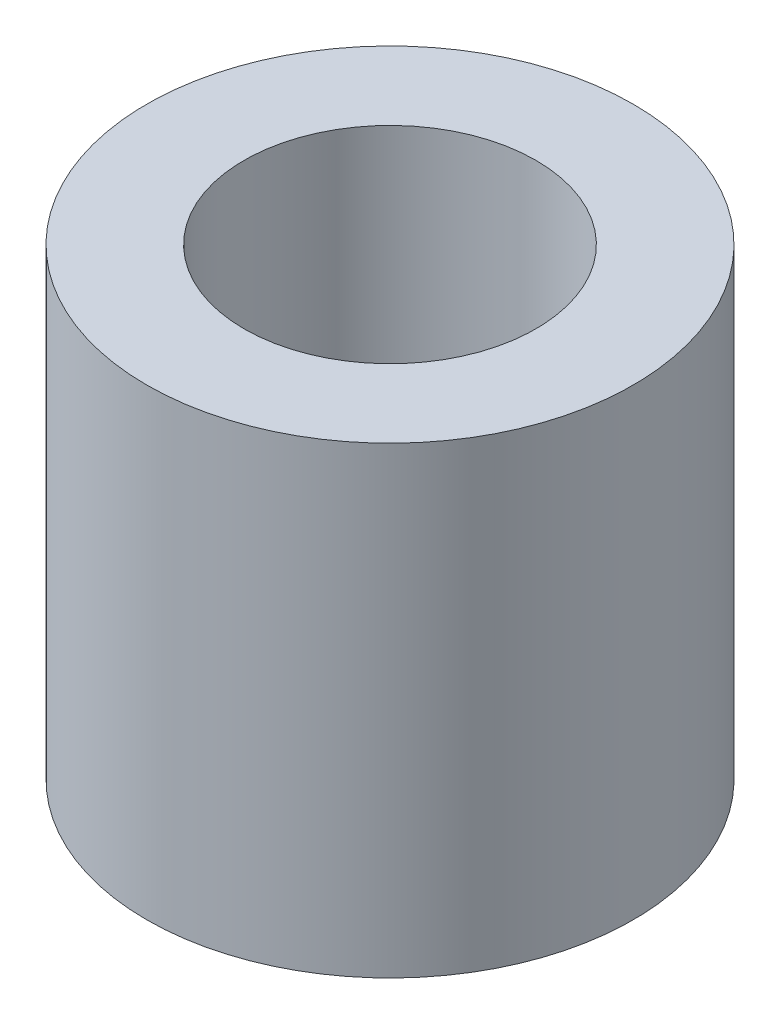
ISO-10303-21;
HEADER;
FILE_DESCRIPTION(('STEP AP214'),'2;1');
FILE_NAME('part.step','',(''),(''),'','','');
FILE_SCHEMA(('AUTOMOTIVE_DESIGN { 1 0 10303 214 1 1 1 1 }'));
ENDSEC;
DATA;
#1=APPLICATION_CONTEXT('core data for automotive mechanical design processes');
#2=APPLICATION_PROTOCOL_DEFINITION('international standard','automotive_design',2000,#1);
#3=PRODUCT_CONTEXT('',#1,'mechanical');
#4=PRODUCT('Part','Part','',(#3));
#5=PRODUCT_RELATED_PRODUCT_CATEGORY('part','',(#4));
#6=PRODUCT_DEFINITION_FORMATION('','',#4);
#7=PRODUCT_DEFINITION_CONTEXT('part definition',#1,'design');
#8=PRODUCT_DEFINITION('design','',#6,#7);
#9=PRODUCT_DEFINITION_SHAPE('','',#8);
#10=(LENGTH_UNIT() NAMED_UNIT(*) SI_UNIT(.MILLI.,.METRE.));
#11=(NAMED_UNIT(*) PLANE_ANGLE_UNIT() SI_UNIT($,.RADIAN.));
#12=(NAMED_UNIT(*) SI_UNIT($,.STERADIAN.) SOLID_ANGLE_UNIT());
#13=UNCERTAINTY_MEASURE_WITH_UNIT(LENGTH_MEASURE(1.E-05),#10,'distance_accuracy_value','');
#14=(GEOMETRIC_REPRESENTATION_CONTEXT(3) GLOBAL_UNCERTAINTY_ASSIGNED_CONTEXT((#13)) GLOBAL_UNIT_ASSIGNED_CONTEXT((#10,
#11,#12)) REPRESENTATION_CONTEXT('',''));
#15=CARTESIAN_POINT('',(0.,0.,0.));
#16=DIRECTION('',(0.,0.,1.));
#17=DIRECTION('',(1.,0.,0.));
#18=AXIS2_PLACEMENT_3D('',#15,#16,#17);
#19=CARTESIAN_POINT('',(0.,4.76,0.));
#20=DIRECTION('',(0.,1.,0.));
#21=DIRECTION('',(0.,0.,1.));
#22=AXIS2_PLACEMENT_3D('',#19,#20,#21);
#23=PLANE('',#22);
#24=CARTESIAN_POINT('',(0.,4.76,0.));
#25=DIRECTION('',(0.,1.,0.));
#26=DIRECTION('',(0.,0.,1.));
#27=AXIS2_PLACEMENT_3D('',#24,#25,#26);
#28=CIRCLE('',#27,2.5);
#29=CARTESIAN_POINT('',(0.,4.76,2.5));
#30=VERTEX_POINT('',#29);
#31=EDGE_CURVE('E10',#30,#30,#28,.T.);
#32=ORIENTED_EDGE('',*,*,#31,.T.);
#33=EDGE_LOOP('',(#32));
#34=FACE_BOUND('',#33,.T.);
#35=CARTESIAN_POINT('',(0.,4.76,0.));
#36=DIRECTION('',(0.,1.,0.));
#37=DIRECTION('',(0.,0.,1.));
#38=AXIS2_PLACEMENT_3D('',#35,#36,#37);
#39=CIRCLE('',#38,1.5);
#40=CARTESIAN_POINT('',(0.,4.76,1.5));
#41=VERTEX_POINT('',#40);
#42=EDGE_CURVE('E56',#41,#41,#39,.T.);
#43=ORIENTED_EDGE('',*,*,#42,.F.);
#44=EDGE_LOOP('',(#43));
#45=FACE_BOUND('',#44,.T.);
#46=ADVANCED_FACE('F43',(#34,#45),#23,.T.);
#47=CARTESIAN_POINT('',(0.,0.,0.));
#48=DIRECTION('',(0.,1.,0.));
#49=DIRECTION('',(0.,0.,1.));
#50=AXIS2_PLACEMENT_3D('',#47,#48,#49);
#51=PLANE('',#50);
#52=CARTESIAN_POINT('',(0.,0.,0.));
#53=DIRECTION('',(0.,1.,0.));
#54=DIRECTION('',(0.,0.,1.));
#55=AXIS2_PLACEMENT_3D('',#52,#53,#54);
#56=CIRCLE('',#55,2.5);
#57=CARTESIAN_POINT('',(0.,0.,2.5));
#58=VERTEX_POINT('',#57);
#59=EDGE_CURVE('E47',#58,#58,#56,.T.);
#60=ORIENTED_EDGE('',*,*,#59,.F.);
#61=EDGE_LOOP('',(#60));
#62=FACE_BOUND('',#61,.T.);
#63=CARTESIAN_POINT('',(0.,0.,0.));
#64=DIRECTION('',(0.,1.,0.));
#65=DIRECTION('',(0.,0.,1.));
#66=AXIS2_PLACEMENT_3D('',#63,#64,#65);
#67=CIRCLE('',#66,1.5);
#68=CARTESIAN_POINT('',(0.,0.,1.5));
#69=VERTEX_POINT('',#68);
#70=EDGE_CURVE('E58',#69,#69,#67,.T.);
#71=ORIENTED_EDGE('',*,*,#70,.T.);
#72=EDGE_LOOP('',(#71));
#73=FACE_BOUND('',#72,.T.);
#74=ADVANCED_FACE('F70',(#62,#73),#51,.F.);
#75=CARTESIAN_POINT('',(0.,4.76,0.));
#76=DIRECTION('',(0.,-1.,0.));
#77=DIRECTION('',(0.,0.,-1.));
#78=AXIS2_PLACEMENT_3D('',#75,#76,#77);
#79=CYLINDRICAL_SURFACE('',#78,2.5);
#80=ORIENTED_EDGE('',*,*,#31,.F.);
#81=EDGE_LOOP('',(#80));
#82=FACE_BOUND('',#81,.T.);
#83=ORIENTED_EDGE('',*,*,#59,.T.);
#84=EDGE_LOOP('',(#83));
#85=FACE_BOUND('',#84,.T.);
#86=ADVANCED_FACE('F45',(#82,#85),#79,.T.);
#87=CARTESIAN_POINT('',(0.,4.76,0.));
#88=DIRECTION('',(0.,-1.,0.));
#89=DIRECTION('',(0.,0.,-1.));
#90=AXIS2_PLACEMENT_3D('',#87,#88,#89);
#91=CYLINDRICAL_SURFACE('',#90,1.5);
#92=ORIENTED_EDGE('',*,*,#42,.T.);
#93=EDGE_LOOP('',(#92));
#94=FACE_BOUND('',#93,.T.);
#95=ORIENTED_EDGE('',*,*,#70,.F.);
#96=EDGE_LOOP('',(#95));
#97=FACE_BOUND('',#96,.T.);
#98=ADVANCED_FACE('F66',(#94,#97),#91,.F.);
#99=CLOSED_SHELL('',(#46,#74,#86,#98));
#100=MANIFOLD_SOLID_BREP('B2',#99);
#101=ADVANCED_BREP_SHAPE_REPRESENTATION('',(#18,#100),#14);
#102=SHAPE_DEFINITION_REPRESENTATION(#9,#101);
ENDSEC;
END-ISO-10303-21;
